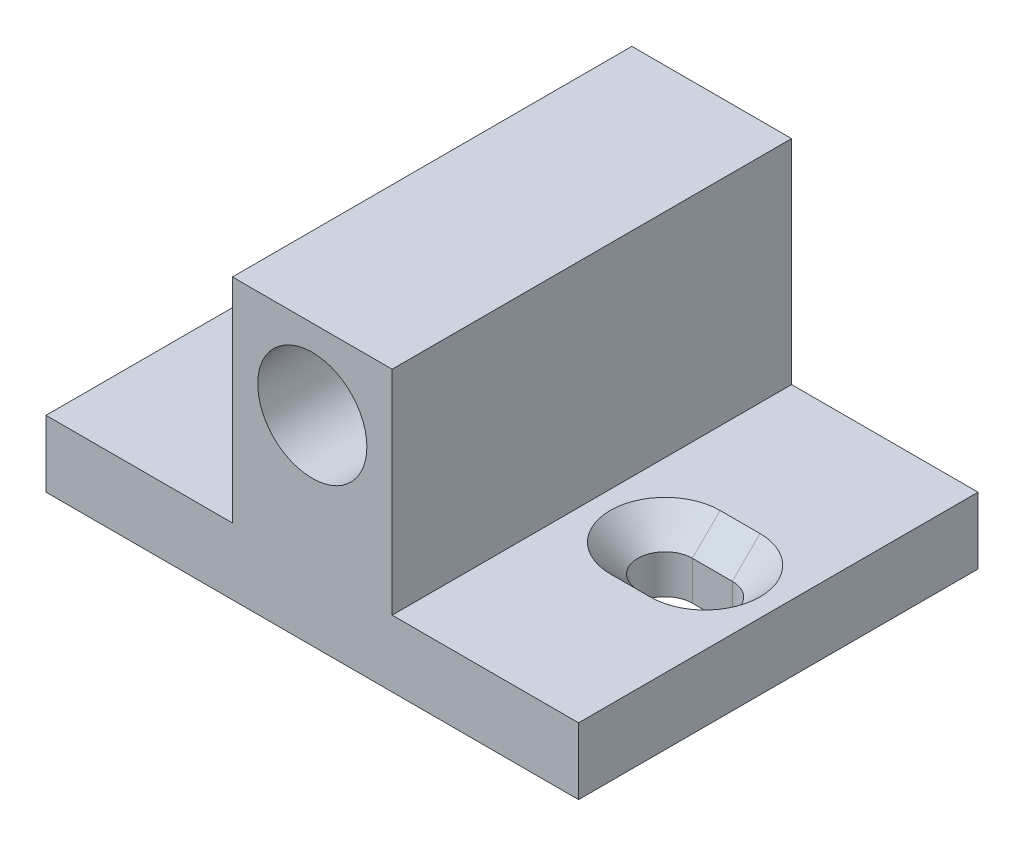
ISO-10303-21;
HEADER;
FILE_DESCRIPTION(('STEP AP214'),'2;1');
FILE_NAME('part.step','',(''),(''),'','','');
FILE_SCHEMA(('AUTOMOTIVE_DESIGN { 1 0 10303 214 1 1 1 1 }'));
ENDSEC;
DATA;
#1=APPLICATION_CONTEXT('core data for automotive mechanical design processes');
#2=APPLICATION_PROTOCOL_DEFINITION('international standard','automotive_design',2000,#1);
#3=PRODUCT_CONTEXT('',#1,'mechanical');
#4=PRODUCT('Part','Part','',(#3));
#5=PRODUCT_RELATED_PRODUCT_CATEGORY('part','',(#4));
#6=PRODUCT_DEFINITION_FORMATION('','',#4);
#7=PRODUCT_DEFINITION_CONTEXT('part definition',#1,'design');
#8=PRODUCT_DEFINITION('design','',#6,#7);
#9=PRODUCT_DEFINITION_SHAPE('','',#8);
#10=(LENGTH_UNIT() NAMED_UNIT(*) SI_UNIT(.MILLI.,.METRE.));
#11=(NAMED_UNIT(*) PLANE_ANGLE_UNIT() SI_UNIT($,.RADIAN.));
#12=(NAMED_UNIT(*) SI_UNIT($,.STERADIAN.) SOLID_ANGLE_UNIT());
#13=UNCERTAINTY_MEASURE_WITH_UNIT(LENGTH_MEASURE(1.E-05),#10,'distance_accuracy_value','');
#14=(GEOMETRIC_REPRESENTATION_CONTEXT(3) GLOBAL_UNCERTAINTY_ASSIGNED_CONTEXT((#13)) GLOBAL_UNIT_ASSIGNED_CONTEXT((#10,
#11,#12)) REPRESENTATION_CONTEXT('',''));
#15=CARTESIAN_POINT('',(0.,0.,0.));
#16=DIRECTION('',(0.,0.,1.));
#17=DIRECTION('',(1.,0.,0.));
#18=AXIS2_PLACEMENT_3D('',#15,#16,#17);
#19=CARTESIAN_POINT('',(0.,5.,0.));
#20=DIRECTION('',(0.,1.,0.));
#21=DIRECTION('',(0.,0.,1.));
#22=AXIS2_PLACEMENT_3D('',#19,#20,#21);
#23=PLANE('',#22);
#24=DIRECTION('',(0.,0.,-1.));
#25=VECTOR('',#24,1.);
#26=CARTESIAN_POINT('',(6.,5.,-15.));
#27=LINE('',#26,#25);
#28=CARTESIAN_POINT('',(6.,5.,15.));
#29=VERTEX_POINT('',#28);
#30=CARTESIAN_POINT('',(6.,5.,-15.));
#31=VERTEX_POINT('',#30);
#32=EDGE_CURVE('E428',#29,#31,#27,.T.);
#33=ORIENTED_EDGE('',*,*,#32,.F.);
#34=DIRECTION('',(1.,0.,0.));
#35=VECTOR('',#34,1.);
#36=CARTESIAN_POINT('',(-20.,5.,15.));
#37=LINE('',#36,#35);
#38=CARTESIAN_POINT('',(20.,5.,15.));
#39=VERTEX_POINT('',#38);
#40=EDGE_CURVE('E467',#29,#39,#37,.T.);
#41=ORIENTED_EDGE('',*,*,#40,.T.);
#42=DIRECTION('',(0.,0.,-1.));
#43=VECTOR('',#42,1.);
#44=CARTESIAN_POINT('',(20.,5.,-15.));
#45=LINE('',#44,#43);
#46=CARTESIAN_POINT('',(20.,5.,-15.));
#47=VERTEX_POINT('',#46);
#48=EDGE_CURVE('E458',#39,#47,#45,.T.);
#49=ORIENTED_EDGE('',*,*,#48,.T.);
#50=DIRECTION('',(-1.,0.,0.));
#51=VECTOR('',#50,1.);
#52=CARTESIAN_POINT('',(-20.,5.,-15.));
#53=LINE('',#52,#51);
#54=EDGE_CURVE('E463',#47,#31,#53,.T.);
#55=ORIENTED_EDGE('',*,*,#54,.T.);
#56=EDGE_LOOP('',(#33,#41,#49,#55));
#57=FACE_BOUND('',#56,.T.);
#58=CARTESIAN_POINT('',(14.5,5.,0.));
#59=DIRECTION('',(0.,1.,0.));
#60=DIRECTION('',(0.,0.,1.));
#61=AXIS2_PLACEMENT_3D('',#58,#59,#60);
#62=CIRCLE('',#61,4.125);
#63=CARTESIAN_POINT('',(14.5,5.,4.125));
#64=VERTEX_POINT('',#63);
#65=CARTESIAN_POINT('',(14.5,5.,-4.12500000000001));
#66=VERTEX_POINT('',#65);
#67=EDGE_CURVE('E201',#64,#66,#62,.T.);
#68=ORIENTED_EDGE('',*,*,#67,.F.);
#69=DIRECTION('',(-1.,0.,0.));
#70=VECTOR('',#69,1.);
#71=CARTESIAN_POINT('',(14.5,5.,4.125));
#72=LINE('',#71,#70);
#73=CARTESIAN_POINT('',(11.5,5.,4.125));
#74=VERTEX_POINT('',#73);
#75=EDGE_CURVE('E326',#64,#74,#72,.T.);
#76=ORIENTED_EDGE('',*,*,#75,.T.);
#77=CARTESIAN_POINT('',(11.5,5.,0.));
#78=DIRECTION('',(0.,1.,0.));
#79=DIRECTION('',(0.,0.,1.));
#80=AXIS2_PLACEMENT_3D('',#77,#78,#79);
#81=CIRCLE('',#80,4.125);
#82=CARTESIAN_POINT('',(11.5,5.,-4.12500000000003));
#83=VERTEX_POINT('',#82);
#84=EDGE_CURVE('E357',#83,#74,#81,.T.);
#85=ORIENTED_EDGE('',*,*,#84,.F.);
#86=DIRECTION('',(-1.,0.,0.));
#87=VECTOR('',#86,1.);
#88=CARTESIAN_POINT('',(14.5,5.,-4.12500000000003));
#89=LINE('',#88,#87);
#90=EDGE_CURVE('E344',#66,#83,#89,.T.);
#91=ORIENTED_EDGE('',*,*,#90,.F.);
#92=EDGE_LOOP('',(#68,#76,#85,#91));
#93=FACE_BOUND('',#92,.T.);
#94=ADVANCED_FACE('F186',(#57,#93),#23,.T.);
#95=DIRECTION('',(0.,0.,1.));
#96=VECTOR('',#95,1.);
#97=CARTESIAN_POINT('',(-6.,5.,-15.));
#98=LINE('',#97,#96);
#99=CARTESIAN_POINT('',(-6.,5.,-15.));
#100=VERTEX_POINT('',#99);
#101=CARTESIAN_POINT('',(-6.,5.,15.));
#102=VERTEX_POINT('',#101);
#103=EDGE_CURVE('E435',#100,#102,#98,.T.);
#104=ORIENTED_EDGE('',*,*,#103,.F.);
#105=CARTESIAN_POINT('',(-20.,5.,-15.));
#106=VERTEX_POINT('',#105);
#107=EDGE_CURVE('E461',#100,#106,#53,.T.);
#108=ORIENTED_EDGE('',*,*,#107,.T.);
#109=DIRECTION('',(0.,0.,1.));
#110=VECTOR('',#109,1.);
#111=CARTESIAN_POINT('',(-20.,5.,-15.));
#112=LINE('',#111,#110);
#113=CARTESIAN_POINT('',(-20.,5.,15.));
#114=VERTEX_POINT('',#113);
#115=EDGE_CURVE('E465',#106,#114,#112,.T.);
#116=ORIENTED_EDGE('',*,*,#115,.T.);
#117=EDGE_CURVE('E468',#114,#102,#37,.T.);
#118=ORIENTED_EDGE('',*,*,#117,.T.);
#119=EDGE_LOOP('',(#104,#108,#116,#118));
#120=FACE_BOUND('',#119,.T.);
#121=CARTESIAN_POINT('',(-14.5,5.,0.));
#122=DIRECTION('',(0.,1.,0.));
#123=DIRECTION('',(0.,0.,1.));
#124=AXIS2_PLACEMENT_3D('',#121,#122,#123);
#125=CIRCLE('',#124,4.125);
#126=CARTESIAN_POINT('',(-14.5,5.,-4.125));
#127=VERTEX_POINT('',#126);
#128=CARTESIAN_POINT('',(-14.5,5.,4.125));
#129=VERTEX_POINT('',#128);
#130=EDGE_CURVE('E390',#127,#129,#125,.T.);
#131=ORIENTED_EDGE('',*,*,#130,.F.);
#132=DIRECTION('',(1.,0.,0.));
#133=VECTOR('',#132,1.);
#134=CARTESIAN_POINT('',(-14.5,5.,-4.125));
#135=LINE('',#134,#133);
#136=CARTESIAN_POINT('',(-11.5,5.,-4.125));
#137=VERTEX_POINT('',#136);
#138=EDGE_CURVE('E382',#127,#137,#135,.T.);
#139=ORIENTED_EDGE('',*,*,#138,.T.);
#140=CARTESIAN_POINT('',(-11.5,5.,0.));
#141=DIRECTION('',(0.,1.,0.));
#142=DIRECTION('',(0.,0.,1.));
#143=AXIS2_PLACEMENT_3D('',#140,#141,#142);
#144=CIRCLE('',#143,4.125);
#145=CARTESIAN_POINT('',(-11.5,5.,4.12500000000003));
#146=VERTEX_POINT('',#145);
#147=EDGE_CURVE('E410',#146,#137,#144,.T.);
#148=ORIENTED_EDGE('',*,*,#147,.F.);
#149=DIRECTION('',(1.,0.,0.));
#150=VECTOR('',#149,1.);
#151=CARTESIAN_POINT('',(-14.5,5.,4.12500000000003));
#152=LINE('',#151,#150);
#153=EDGE_CURVE('E369',#129,#146,#152,.T.);
#154=ORIENTED_EDGE('',*,*,#153,.F.);
#155=EDGE_LOOP('',(#131,#139,#148,#154));
#156=FACE_BOUND('',#155,.T.);
#157=ADVANCED_FACE('F518',(#120,#156),#23,.T.);
#158=CARTESIAN_POINT('',(20.,5.,-15.));
#159=DIRECTION('',(-1.,0.,0.));
#160=DIRECTION('',(0.,0.,1.));
#161=AXIS2_PLACEMENT_3D('',#158,#159,#160);
#162=PLANE('',#161);
#163=DIRECTION('',(0.,0.,-1.));
#164=VECTOR('',#163,1.);
#165=CARTESIAN_POINT('',(20.,0.,-15.));
#166=LINE('',#165,#164);
#167=CARTESIAN_POINT('',(20.,0.,15.));
#168=VERTEX_POINT('',#167);
#169=CARTESIAN_POINT('',(20.,0.,-15.));
#170=VERTEX_POINT('',#169);
#171=EDGE_CURVE('E457',#168,#170,#166,.T.);
#172=ORIENTED_EDGE('',*,*,#171,.T.);
#173=DIRECTION('',(0.,-1.,0.));
#174=VECTOR('',#173,1.);
#175=CARTESIAN_POINT('',(20.,5.,-15.));
#176=LINE('',#175,#174);
#177=EDGE_CURVE('E13',#47,#170,#176,.T.);
#178=ORIENTED_EDGE('',*,*,#177,.F.);
#179=ORIENTED_EDGE('',*,*,#48,.F.);
#180=DIRECTION('',(0.,-1.,0.));
#181=VECTOR('',#180,1.);
#182=CARTESIAN_POINT('',(20.,5.,15.));
#183=LINE('',#182,#181);
#184=EDGE_CURVE('E470',#39,#168,#183,.T.);
#185=ORIENTED_EDGE('',*,*,#184,.T.);
#186=EDGE_LOOP('',(#172,#178,#179,#185));
#187=FACE_BOUND('',#186,.T.);
#188=ADVANCED_FACE('F188',(#187),#162,.F.);
#189=CARTESIAN_POINT('',(-20.,5.,-15.));
#190=DIRECTION('',(0.,0.,1.));
#191=DIRECTION('',(1.,0.,0.));
#192=AXIS2_PLACEMENT_3D('',#189,#190,#191);
#193=PLANE('',#192);
#194=DIRECTION('',(-1.,0.,0.));
#195=VECTOR('',#194,1.);
#196=CARTESIAN_POINT('',(-20.,0.,-15.));
#197=LINE('',#196,#195);
#198=CARTESIAN_POINT('',(-20.,0.,-15.));
#199=VERTEX_POINT('',#198);
#200=EDGE_CURVE('E473',#170,#199,#197,.T.);
#201=ORIENTED_EDGE('',*,*,#200,.T.);
#202=DIRECTION('',(0.,-1.,0.));
#203=VECTOR('',#202,1.);
#204=CARTESIAN_POINT('',(-20.,5.,-15.));
#205=LINE('',#204,#203);
#206=EDGE_CURVE('E194',#106,#199,#205,.T.);
#207=ORIENTED_EDGE('',*,*,#206,.F.);
#208=ORIENTED_EDGE('',*,*,#107,.F.);
#209=DIRECTION('',(0.,-1.,0.));
#210=VECTOR('',#209,1.);
#211=CARTESIAN_POINT('',(-6.,21.,-15.));
#212=LINE('',#211,#210);
#213=CARTESIAN_POINT('',(-6.,21.,-15.));
#214=VERTEX_POINT('',#213);
#215=EDGE_CURVE('E451',#214,#100,#212,.T.);
#216=ORIENTED_EDGE('',*,*,#215,.F.);
#217=DIRECTION('',(-1.,0.,0.));
#218=VECTOR('',#217,1.);
#219=CARTESIAN_POINT('',(-6.,21.,-15.));
#220=LINE('',#219,#218);
#221=CARTESIAN_POINT('',(6.,21.,-15.));
#222=VERTEX_POINT('',#221);
#223=EDGE_CURVE('E434',#222,#214,#220,.T.);
#224=ORIENTED_EDGE('',*,*,#223,.F.);
#225=DIRECTION('',(0.,-1.,0.));
#226=VECTOR('',#225,1.);
#227=CARTESIAN_POINT('',(6.,21.,-15.));
#228=LINE('',#227,#226);
#229=EDGE_CURVE('E454',#222,#31,#228,.T.);
#230=ORIENTED_EDGE('',*,*,#229,.T.);
#231=ORIENTED_EDGE('',*,*,#54,.F.);
#232=ORIENTED_EDGE('',*,*,#177,.T.);
#233=EDGE_LOOP('',(#201,#207,#208,#216,#224,#230,#231,#232));
#234=FACE_BOUND('',#233,.T.);
#235=ADVANCED_FACE('F520',(#234),#193,.F.);
#236=CARTESIAN_POINT('',(-20.,5.,-15.));
#237=DIRECTION('',(1.,0.,0.));
#238=DIRECTION('',(0.,0.,-1.));
#239=AXIS2_PLACEMENT_3D('',#236,#237,#238);
#240=PLANE('',#239);
#241=DIRECTION('',(0.,0.,1.));
#242=VECTOR('',#241,1.);
#243=CARTESIAN_POINT('',(-20.,0.,-15.));
#244=LINE('',#243,#242);
#245=CARTESIAN_POINT('',(-20.,0.,15.));
#246=VERTEX_POINT('',#245);
#247=EDGE_CURVE('E475',#199,#246,#244,.T.);
#248=ORIENTED_EDGE('',*,*,#247,.T.);
#249=DIRECTION('',(0.,-1.,0.));
#250=VECTOR('',#249,1.);
#251=CARTESIAN_POINT('',(-20.,5.,15.));
#252=LINE('',#251,#250);
#253=EDGE_CURVE('E480',#114,#246,#252,.T.);
#254=ORIENTED_EDGE('',*,*,#253,.F.);
#255=ORIENTED_EDGE('',*,*,#115,.F.);
#256=ORIENTED_EDGE('',*,*,#206,.T.);
#257=EDGE_LOOP('',(#248,#254,#255,#256));
#258=FACE_BOUND('',#257,.T.);
#259=ADVANCED_FACE('F487',(#258),#240,.F.);
#260=CARTESIAN_POINT('',(-20.,5.,15.));
#261=DIRECTION('',(0.,0.,-1.));
#262=DIRECTION('',(-1.,0.,0.));
#263=AXIS2_PLACEMENT_3D('',#260,#261,#262);
#264=PLANE('',#263);
#265=CARTESIAN_POINT('',(0.,15.,15.));
#266=DIRECTION('',(0.,0.,1.));
#267=DIRECTION('',(1.,0.,0.));
#268=AXIS2_PLACEMENT_3D('',#265,#266,#267);
#269=CIRCLE('',#268,4.1);
#270=CARTESIAN_POINT('',(4.1,15.,15.));
#271=VERTEX_POINT('',#270);
#272=EDGE_CURVE('E424',#271,#271,#269,.T.);
#273=ORIENTED_EDGE('',*,*,#272,.F.);
#274=EDGE_LOOP('',(#273));
#275=FACE_BOUND('',#274,.T.);
#276=DIRECTION('',(1.,0.,0.));
#277=VECTOR('',#276,1.);
#278=CARTESIAN_POINT('',(-20.,0.,15.));
#279=LINE('',#278,#277);
#280=EDGE_CURVE('E462',#246,#168,#279,.T.);
#281=ORIENTED_EDGE('',*,*,#280,.T.);
#282=ORIENTED_EDGE('',*,*,#184,.F.);
#283=ORIENTED_EDGE('',*,*,#40,.F.);
#284=DIRECTION('',(0.,-1.,0.));
#285=VECTOR('',#284,1.);
#286=CARTESIAN_POINT('',(6.,21.,15.));
#287=LINE('',#286,#285);
#288=CARTESIAN_POINT('',(6.,21.,15.));
#289=VERTEX_POINT('',#288);
#290=EDGE_CURVE('E441',#289,#29,#287,.T.);
#291=ORIENTED_EDGE('',*,*,#290,.F.);
#292=DIRECTION('',(1.,0.,0.));
#293=VECTOR('',#292,1.);
#294=CARTESIAN_POINT('',(-6.,21.,15.));
#295=LINE('',#294,#293);
#296=CARTESIAN_POINT('',(-6.,21.,15.));
#297=VERTEX_POINT('',#296);
#298=EDGE_CURVE('E439',#297,#289,#295,.T.);
#299=ORIENTED_EDGE('',*,*,#298,.F.);
#300=DIRECTION('',(0.,-1.,0.));
#301=VECTOR('',#300,1.);
#302=CARTESIAN_POINT('',(-6.,21.,15.));
#303=LINE('',#302,#301);
#304=EDGE_CURVE('E448',#297,#102,#303,.T.);
#305=ORIENTED_EDGE('',*,*,#304,.T.);
#306=ORIENTED_EDGE('',*,*,#117,.F.);
#307=ORIENTED_EDGE('',*,*,#253,.T.);
#308=EDGE_LOOP('',(#281,#282,#283,#291,#299,#305,#306,#307));
#309=FACE_BOUND('',#308,.T.);
#310=ADVANCED_FACE('F497',(#275,#309),#264,.F.);
#311=CARTESIAN_POINT('',(0.,0.,0.));
#312=DIRECTION('',(0.,1.,0.));
#313=DIRECTION('',(0.,0.,1.));
#314=AXIS2_PLACEMENT_3D('',#311,#312,#313);
#315=PLANE('',#314);
#316=DIRECTION('',(-1.,0.,0.));
#317=VECTOR('',#316,1.);
#318=CARTESIAN_POINT('',(14.5,0.,-2.04999999999999));
#319=LINE('',#318,#317);
#320=CARTESIAN_POINT('',(14.5,0.,-2.04999999999999));
#321=VERTEX_POINT('',#320);
#322=CARTESIAN_POINT('',(11.5,0.,-2.04999999999999));
#323=VERTEX_POINT('',#322);
#324=EDGE_CURVE('E863',#321,#323,#319,.T.);
#325=ORIENTED_EDGE('',*,*,#324,.T.);
#326=CARTESIAN_POINT('',(11.5,0.,0.));
#327=DIRECTION('',(0.,1.,0.));
#328=DIRECTION('',(0.,0.,1.));
#329=AXIS2_PLACEMENT_3D('',#326,#327,#328);
#330=CIRCLE('',#329,2.04999999999999);
#331=CARTESIAN_POINT('',(11.5,0.,2.04999999999999));
#332=VERTEX_POINT('',#331);
#333=EDGE_CURVE('E362',#323,#332,#330,.T.);
#334=ORIENTED_EDGE('',*,*,#333,.T.);
#335=DIRECTION('',(-1.,0.,0.));
#336=VECTOR('',#335,1.);
#337=CARTESIAN_POINT('',(14.5,0.,2.04999999999999));
#338=LINE('',#337,#336);
#339=CARTESIAN_POINT('',(14.5,0.,2.04999999999999));
#340=VERTEX_POINT('',#339);
#341=EDGE_CURVE('E865',#340,#332,#338,.T.);
#342=ORIENTED_EDGE('',*,*,#341,.F.);
#343=CARTESIAN_POINT('',(14.5,0.,0.));
#344=DIRECTION('',(0.,1.,0.));
#345=DIRECTION('',(0.,0.,1.));
#346=AXIS2_PLACEMENT_3D('',#343,#344,#345);
#347=CIRCLE('',#346,2.04999999999999);
#348=EDGE_CURVE('E209',#340,#321,#347,.T.);
#349=ORIENTED_EDGE('',*,*,#348,.T.);
#350=EDGE_LOOP('',(#325,#334,#342,#349));
#351=FACE_BOUND('',#350,.T.);
#352=DIRECTION('',(1.,0.,0.));
#353=VECTOR('',#352,1.);
#354=CARTESIAN_POINT('',(-14.5,0.,-2.04999999999999));
#355=LINE('',#354,#353);
#356=CARTESIAN_POINT('',(-14.5,0.,-2.04999999999999));
#357=VERTEX_POINT('',#356);
#358=CARTESIAN_POINT('',(-11.5,0.,-2.04999999999999));
#359=VERTEX_POINT('',#358);
#360=EDGE_CURVE('E377',#357,#359,#355,.T.);
#361=ORIENTED_EDGE('',*,*,#360,.F.);
#362=CARTESIAN_POINT('',(-14.5,0.,0.));
#363=DIRECTION('',(0.,1.,0.));
#364=DIRECTION('',(0.,0.,1.));
#365=AXIS2_PLACEMENT_3D('',#362,#363,#364);
#366=CIRCLE('',#365,2.04999999999999);
#367=CARTESIAN_POINT('',(-14.5,0.,2.04999999999999));
#368=VERTEX_POINT('',#367);
#369=EDGE_CURVE('E395',#357,#368,#366,.T.);
#370=ORIENTED_EDGE('',*,*,#369,.T.);
#371=DIRECTION('',(1.,0.,0.));
#372=VECTOR('',#371,1.);
#373=CARTESIAN_POINT('',(-14.5,0.,2.04999999999999));
#374=LINE('',#373,#372);
#375=CARTESIAN_POINT('',(-11.5,0.,2.04999999999999));
#376=VERTEX_POINT('',#375);
#377=EDGE_CURVE('E374',#368,#376,#374,.T.);
#378=ORIENTED_EDGE('',*,*,#377,.T.);
#379=CARTESIAN_POINT('',(-11.5,0.,0.));
#380=DIRECTION('',(0.,1.,0.));
#381=DIRECTION('',(0.,0.,1.));
#382=AXIS2_PLACEMENT_3D('',#379,#380,#381);
#383=CIRCLE('',#382,2.04999999999999);
#384=EDGE_CURVE('E416',#376,#359,#383,.T.);
#385=ORIENTED_EDGE('',*,*,#384,.T.);
#386=EDGE_LOOP('',(#361,#370,#378,#385));
#387=FACE_BOUND('',#386,.T.);
#388=ORIENTED_EDGE('',*,*,#171,.F.);
#389=ORIENTED_EDGE('',*,*,#280,.F.);
#390=ORIENTED_EDGE('',*,*,#247,.F.);
#391=ORIENTED_EDGE('',*,*,#200,.F.);
#392=EDGE_LOOP('',(#388,#389,#390,#391));
#393=FACE_BOUND('',#392,.T.);
#394=ADVANCED_FACE('F494',(#351,#387,#393),#315,.F.);
#395=CARTESIAN_POINT('',(6.,21.,-15.));
#396=DIRECTION('',(-1.,0.,0.));
#397=DIRECTION('',(0.,0.,1.));
#398=AXIS2_PLACEMENT_3D('',#395,#396,#397);
#399=PLANE('',#398);
#400=ORIENTED_EDGE('',*,*,#32,.T.);
#401=ORIENTED_EDGE('',*,*,#229,.F.);
#402=DIRECTION('',(0.,0.,-1.));
#403=VECTOR('',#402,1.);
#404=CARTESIAN_POINT('',(6.,21.,-15.));
#405=LINE('',#404,#403);
#406=EDGE_CURVE('E431',#289,#222,#405,.T.);
#407=ORIENTED_EDGE('',*,*,#406,.F.);
#408=ORIENTED_EDGE('',*,*,#290,.T.);
#409=EDGE_LOOP('',(#400,#401,#407,#408));
#410=FACE_BOUND('',#409,.T.);
#411=ADVANCED_FACE('F508',(#410),#399,.F.);
#412=CARTESIAN_POINT('',(-6.,21.,-15.));
#413=DIRECTION('',(1.,0.,0.));
#414=DIRECTION('',(0.,0.,-1.));
#415=AXIS2_PLACEMENT_3D('',#412,#413,#414);
#416=PLANE('',#415);
#417=ORIENTED_EDGE('',*,*,#103,.T.);
#418=ORIENTED_EDGE('',*,*,#304,.F.);
#419=DIRECTION('',(0.,0.,1.));
#420=VECTOR('',#419,1.);
#421=CARTESIAN_POINT('',(-6.,21.,-15.));
#422=LINE('',#421,#420);
#423=EDGE_CURVE('E437',#214,#297,#422,.T.);
#424=ORIENTED_EDGE('',*,*,#423,.F.);
#425=ORIENTED_EDGE('',*,*,#215,.T.);
#426=EDGE_LOOP('',(#417,#418,#424,#425));
#427=FACE_BOUND('',#426,.T.);
#428=ADVANCED_FACE('F516',(#427),#416,.F.);
#429=CARTESIAN_POINT('',(0.,21.,0.));
#430=DIRECTION('',(0.,1.,0.));
#431=DIRECTION('',(0.,0.,1.));
#432=AXIS2_PLACEMENT_3D('',#429,#430,#431);
#433=PLANE('',#432);
#434=ORIENTED_EDGE('',*,*,#406,.T.);
#435=ORIENTED_EDGE('',*,*,#223,.T.);
#436=ORIENTED_EDGE('',*,*,#423,.T.);
#437=ORIENTED_EDGE('',*,*,#298,.T.);
#438=EDGE_LOOP('',(#434,#435,#436,#437));
#439=FACE_BOUND('',#438,.T.);
#440=ADVANCED_FACE('F511',(#439),#433,.T.);
#441=CARTESIAN_POINT('',(0.,15.,-10.));
#442=DIRECTION('',(0.,0.,1.));
#443=DIRECTION('',(1.,0.,0.));
#444=AXIS2_PLACEMENT_3D('',#441,#442,#443);
#445=CYLINDRICAL_SURFACE('',#444,4.1);
#446=CARTESIAN_POINT('',(0.,15.,-10.));
#447=DIRECTION('',(0.,0.,1.));
#448=DIRECTION('',(1.,0.,0.));
#449=AXIS2_PLACEMENT_3D('',#446,#447,#448);
#450=CIRCLE('',#449,4.1);
#451=CARTESIAN_POINT('',(4.1,15.,-10.));
#452=VERTEX_POINT('',#451);
#453=EDGE_CURVE('E425',#452,#452,#450,.T.);
#454=ORIENTED_EDGE('',*,*,#453,.F.);
#455=EDGE_LOOP('',(#454));
#456=FACE_BOUND('',#455,.T.);
#457=ORIENTED_EDGE('',*,*,#272,.T.);
#458=EDGE_LOOP('',(#457));
#459=FACE_BOUND('',#458,.T.);
#460=ADVANCED_FACE('F544',(#456,#459),#445,.F.);
#461=CARTESIAN_POINT('',(0.,15.,-10.));
#462=DIRECTION('',(0.,0.,1.));
#463=DIRECTION('',(1.,0.,0.));
#464=AXIS2_PLACEMENT_3D('',#461,#462,#463);
#465=PLANE('',#464);
#466=ORIENTED_EDGE('',*,*,#453,.T.);
#467=EDGE_LOOP('',(#466));
#468=FACE_BOUND('',#467,.T.);
#469=ADVANCED_FACE('F546',(#468),#465,.T.);
#470=CARTESIAN_POINT('',(-11.5,5.,0.));
#471=DIRECTION('',(0.,1.,0.));
#472=DIRECTION('',(0.,0.,1.));
#473=AXIS2_PLACEMENT_3D('',#470,#471,#472);
#474=CYLINDRICAL_SURFACE('',#473,2.04999999999999);
#475=ORIENTED_EDGE('',*,*,#384,.F.);
#476=DIRECTION('',(0.,1.,0.));
#477=VECTOR('',#476,1.);
#478=CARTESIAN_POINT('',(-11.5,5.,2.04999999999999));
#479=LINE('',#478,#477);
#480=CARTESIAN_POINT('',(-11.5,2.925,2.04999999999999));
#481=VERTEX_POINT('',#480);
#482=EDGE_CURVE('E407',#481,#376,#479,.F.);
#483=ORIENTED_EDGE('',*,*,#482,.F.);
#484=CARTESIAN_POINT('',(-11.5,2.925,0.));
#485=DIRECTION('',(0.,1.,0.));
#486=DIRECTION('',(0.,0.,1.));
#487=AXIS2_PLACEMENT_3D('',#484,#485,#486);
#488=CIRCLE('',#487,2.05);
#489=CARTESIAN_POINT('',(-11.5,2.925,-2.05));
#490=VERTEX_POINT('',#489);
#491=EDGE_CURVE('E413',#481,#490,#488,.T.);
#492=ORIENTED_EDGE('',*,*,#491,.T.);
#493=DIRECTION('',(0.,1.,0.));
#494=VECTOR('',#493,1.);
#495=CARTESIAN_POINT('',(-11.5,5.,-2.04999999999999));
#496=LINE('',#495,#494);
#497=EDGE_CURVE('E404',#359,#490,#496,.T.);
#498=ORIENTED_EDGE('',*,*,#497,.F.);
#499=EDGE_LOOP('',(#475,#483,#492,#498));
#500=FACE_BOUND('',#499,.T.);
#501=ADVANCED_FACE('F553',(#500),#474,.F.);
#502=CARTESIAN_POINT('',(-11.5,5.,0.));
#503=DIRECTION('',(0.,1.,0.));
#504=DIRECTION('',(0.,0.,1.));
#505=AXIS2_PLACEMENT_3D('',#502,#503,#504);
#506=CONICAL_SURFACE('',#505,4.125,0.785398163397448);
#507=ORIENTED_EDGE('',*,*,#491,.F.);
#508=DIRECTION('',(0.,0.707106781186548,0.707106781186547));
#509=VECTOR('',#508,1.);
#510=CARTESIAN_POINT('',(-11.5,0.874999999999998,0.));
#511=LINE('',#510,#509);
#512=EDGE_CURVE('E421',#146,#481,#511,.F.);
#513=ORIENTED_EDGE('',*,*,#512,.F.);
#514=ORIENTED_EDGE('',*,*,#147,.T.);
#515=DIRECTION('',(0.,-0.707106781186548,0.707106781186547));
#516=VECTOR('',#515,1.);
#517=CARTESIAN_POINT('',(-11.5,0.874999999999998,0.));
#518=LINE('',#517,#516);
#519=EDGE_CURVE('E419',#490,#137,#518,.F.);
#520=ORIENTED_EDGE('',*,*,#519,.F.);
#521=EDGE_LOOP('',(#507,#513,#514,#520));
#522=FACE_BOUND('',#521,.T.);
#523=ADVANCED_FACE('F729',(#522),#506,.F.);
#524=CARTESIAN_POINT('',(-14.5,5.,0.));
#525=DIRECTION('',(0.,1.,0.));
#526=DIRECTION('',(0.,0.,1.));
#527=AXIS2_PLACEMENT_3D('',#524,#525,#526);
#528=CYLINDRICAL_SURFACE('',#527,2.04999999999999);
#529=CARTESIAN_POINT('',(-14.5,2.925,0.));
#530=DIRECTION('',(0.,1.,0.));
#531=DIRECTION('',(0.,0.,1.));
#532=AXIS2_PLACEMENT_3D('',#529,#530,#531);
#533=CIRCLE('',#532,2.05);
#534=CARTESIAN_POINT('',(-14.5,2.925,-2.05));
#535=VERTEX_POINT('',#534);
#536=CARTESIAN_POINT('',(-14.5,2.925,2.04999999999999));
#537=VERTEX_POINT('',#536);
#538=EDGE_CURVE('E392',#535,#537,#533,.T.);
#539=ORIENTED_EDGE('',*,*,#538,.T.);
#540=DIRECTION('',(0.,1.,0.));
#541=VECTOR('',#540,1.);
#542=CARTESIAN_POINT('',(-14.5,5.,2.04999999999999));
#543=LINE('',#542,#541);
#544=EDGE_CURVE('E385',#368,#537,#543,.T.);
#545=ORIENTED_EDGE('',*,*,#544,.F.);
#546=ORIENTED_EDGE('',*,*,#369,.F.);
#547=DIRECTION('',(0.,1.,0.));
#548=VECTOR('',#547,1.);
#549=CARTESIAN_POINT('',(-14.5,5.,-2.04999999999999));
#550=LINE('',#549,#548);
#551=EDGE_CURVE('E388',#535,#357,#550,.F.);
#552=ORIENTED_EDGE('',*,*,#551,.F.);
#553=EDGE_LOOP('',(#539,#545,#546,#552));
#554=FACE_BOUND('',#553,.T.);
#555=ADVANCED_FACE('F719',(#554),#528,.F.);
#556=CARTESIAN_POINT('',(-14.5,5.,0.));
#557=DIRECTION('',(0.,1.,0.));
#558=DIRECTION('',(0.,0.,1.));
#559=AXIS2_PLACEMENT_3D('',#556,#557,#558);
#560=CONICAL_SURFACE('',#559,4.125,0.785398163397448);
#561=ORIENTED_EDGE('',*,*,#130,.T.);
#562=DIRECTION('',(0.,-0.707106781186548,-0.707106781186547));
#563=VECTOR('',#562,1.);
#564=CARTESIAN_POINT('',(-14.5,0.874999999999998,0.));
#565=LINE('',#564,#563);
#566=EDGE_CURVE('E398',#537,#129,#565,.F.);
#567=ORIENTED_EDGE('',*,*,#566,.F.);
#568=ORIENTED_EDGE('',*,*,#538,.F.);
#569=DIRECTION('',(0.,0.707106781186548,-0.707106781186547));
#570=VECTOR('',#569,1.);
#571=CARTESIAN_POINT('',(-14.5,0.874999999999998,0.));
#572=LINE('',#571,#570);
#573=EDGE_CURVE('E401',#127,#535,#572,.F.);
#574=ORIENTED_EDGE('',*,*,#573,.F.);
#575=EDGE_LOOP('',(#561,#567,#568,#574));
#576=FACE_BOUND('',#575,.T.);
#577=ADVANCED_FACE('F709',(#576),#560,.F.);
#578=CARTESIAN_POINT('',(-14.5,0.874999999999998,0.));
#579=DIRECTION('',(0.,-0.707106781186547,-0.707106781186548));
#580=DIRECTION('',(0.,0.707106781186548,-0.707106781186547));
#581=AXIS2_PLACEMENT_3D('',#578,#579,#580);
#582=PLANE('',#581);
#583=ORIENTED_EDGE('',*,*,#519,.T.);
#584=ORIENTED_EDGE('',*,*,#138,.F.);
#585=ORIENTED_EDGE('',*,*,#573,.T.);
#586=DIRECTION('',(1.,0.,0.));
#587=VECTOR('',#586,1.);
#588=CARTESIAN_POINT('',(-14.5,2.925,-2.05));
#589=LINE('',#588,#587);
#590=EDGE_CURVE('E380',#535,#490,#589,.T.);
#591=ORIENTED_EDGE('',*,*,#590,.T.);
#592=EDGE_LOOP('',(#583,#584,#585,#591));
#593=FACE_BOUND('',#592,.T.);
#594=ADVANCED_FACE('F699',(#593),#582,.F.);
#595=CARTESIAN_POINT('',(-14.5,5.,-2.04999999999999));
#596=DIRECTION('',(0.,0.,-1.));
#597=DIRECTION('',(-1.,0.,0.));
#598=AXIS2_PLACEMENT_3D('',#595,#596,#597);
#599=PLANE('',#598);
#600=ORIENTED_EDGE('',*,*,#497,.T.);
#601=ORIENTED_EDGE('',*,*,#590,.F.);
#602=ORIENTED_EDGE('',*,*,#551,.T.);
#603=ORIENTED_EDGE('',*,*,#360,.T.);
#604=EDGE_LOOP('',(#600,#601,#602,#603));
#605=FACE_BOUND('',#604,.T.);
#606=ADVANCED_FACE('F689',(#605),#599,.F.);
#607=CARTESIAN_POINT('',(-14.5,5.,2.04999999999999));
#608=DIRECTION('',(0.,0.,1.));
#609=DIRECTION('',(1.,0.,0.));
#610=AXIS2_PLACEMENT_3D('',#607,#608,#609);
#611=PLANE('',#610);
#612=ORIENTED_EDGE('',*,*,#482,.T.);
#613=ORIENTED_EDGE('',*,*,#377,.F.);
#614=ORIENTED_EDGE('',*,*,#544,.T.);
#615=DIRECTION('',(1.,0.,0.));
#616=VECTOR('',#615,1.);
#617=CARTESIAN_POINT('',(-14.5,2.925,2.04999999999999));
#618=LINE('',#617,#616);
#619=EDGE_CURVE('E371',#537,#481,#618,.T.);
#620=ORIENTED_EDGE('',*,*,#619,.T.);
#621=EDGE_LOOP('',(#612,#613,#614,#620));
#622=FACE_BOUND('',#621,.T.);
#623=ADVANCED_FACE('F680',(#622),#611,.F.);
#624=CARTESIAN_POINT('',(-14.5,0.874999999999998,0.));
#625=DIRECTION('',(0.,-0.707106781186547,0.707106781186548));
#626=DIRECTION('',(0.,-0.707106781186548,-0.707106781186547));
#627=AXIS2_PLACEMENT_3D('',#624,#625,#626);
#628=PLANE('',#627);
#629=ORIENTED_EDGE('',*,*,#512,.T.);
#630=ORIENTED_EDGE('',*,*,#619,.F.);
#631=ORIENTED_EDGE('',*,*,#566,.T.);
#632=ORIENTED_EDGE('',*,*,#153,.T.);
#633=EDGE_LOOP('',(#629,#630,#631,#632));
#634=FACE_BOUND('',#633,.T.);
#635=ADVANCED_FACE('F586',(#634),#628,.F.);
#636=CARTESIAN_POINT('',(11.5,5.,0.));
#637=DIRECTION('',(0.,1.,0.));
#638=DIRECTION('',(0.,0.,1.));
#639=AXIS2_PLACEMENT_3D('',#636,#637,#638);
#640=CYLINDRICAL_SURFACE('',#639,2.04999999999999);
#641=CARTESIAN_POINT('',(11.5,2.925,0.));
#642=DIRECTION('',(0.,1.,0.));
#643=DIRECTION('',(0.,0.,1.));
#644=AXIS2_PLACEMENT_3D('',#641,#642,#643);
#645=CIRCLE('',#644,2.05);
#646=CARTESIAN_POINT('',(11.5,2.925,-2.05));
#647=VERTEX_POINT('',#646);
#648=CARTESIAN_POINT('',(11.5,2.925,2.05));
#649=VERTEX_POINT('',#648);
#650=EDGE_CURVE('E359',#647,#649,#645,.T.);
#651=ORIENTED_EDGE('',*,*,#650,.T.);
#652=DIRECTION('',(0.,1.,0.));
#653=VECTOR('',#652,1.);
#654=CARTESIAN_POINT('',(11.5,5.,2.04999999999999));
#655=LINE('',#654,#653);
#656=EDGE_CURVE('E340',#332,#649,#655,.T.);
#657=ORIENTED_EDGE('',*,*,#656,.F.);
#658=ORIENTED_EDGE('',*,*,#333,.F.);
#659=DIRECTION('',(0.,1.,0.));
#660=VECTOR('',#659,1.);
#661=CARTESIAN_POINT('',(11.5,5.,-2.05));
#662=LINE('',#661,#660);
#663=EDGE_CURVE('E355',#647,#323,#662,.F.);
#664=ORIENTED_EDGE('',*,*,#663,.F.);
#665=EDGE_LOOP('',(#651,#657,#658,#664));
#666=FACE_BOUND('',#665,.T.);
#667=ADVANCED_FACE('F580',(#666),#640,.F.);
#668=CARTESIAN_POINT('',(11.5,5.,0.));
#669=DIRECTION('',(0.,1.,0.));
#670=DIRECTION('',(0.,0.,1.));
#671=AXIS2_PLACEMENT_3D('',#668,#669,#670);
#672=CONICAL_SURFACE('',#671,4.125,0.785398163397448);
#673=ORIENTED_EDGE('',*,*,#84,.T.);
#674=DIRECTION('',(0.,-0.707106781186547,-0.707106781186548));
#675=VECTOR('',#674,1.);
#676=CARTESIAN_POINT('',(11.5,0.874999999999997,0.));
#677=LINE('',#676,#675);
#678=EDGE_CURVE('E331',#649,#74,#677,.F.);
#679=ORIENTED_EDGE('',*,*,#678,.F.);
#680=ORIENTED_EDGE('',*,*,#650,.F.);
#681=DIRECTION('',(0.,0.707106781186547,-0.707106781186548));
#682=VECTOR('',#681,1.);
#683=CARTESIAN_POINT('',(11.5,0.874999999999997,0.));
#684=LINE('',#683,#682);
#685=EDGE_CURVE('E366',#83,#647,#684,.F.);
#686=ORIENTED_EDGE('',*,*,#685,.F.);
#687=EDGE_LOOP('',(#673,#679,#680,#686));
#688=FACE_BOUND('',#687,.T.);
#689=ADVANCED_FACE('F585',(#688),#672,.F.);
#690=CARTESIAN_POINT('',(14.5,5.,0.));
#691=DIRECTION('',(0.,1.,0.));
#692=DIRECTION('',(0.,0.,1.));
#693=AXIS2_PLACEMENT_3D('',#690,#691,#692);
#694=CYLINDRICAL_SURFACE('',#693,2.04999999999999);
#695=CARTESIAN_POINT('',(14.5,2.925,0.));
#696=DIRECTION('',(0.,1.,0.));
#697=DIRECTION('',(0.,0.,1.));
#698=AXIS2_PLACEMENT_3D('',#695,#696,#697);
#699=CIRCLE('',#698,2.05);
#700=CARTESIAN_POINT('',(14.5,2.925,2.04999999999999));
#701=VERTEX_POINT('',#700);
#702=CARTESIAN_POINT('',(14.5,2.925,-2.05));
#703=VERTEX_POINT('',#702);
#704=EDGE_CURVE('E339',#701,#703,#699,.T.);
#705=ORIENTED_EDGE('',*,*,#704,.T.);
#706=DIRECTION('',(0.,1.,0.));
#707=VECTOR('',#706,1.);
#708=CARTESIAN_POINT('',(14.5,5.,-2.05));
#709=LINE('',#708,#707);
#710=EDGE_CURVE('E335',#321,#703,#709,.T.);
#711=ORIENTED_EDGE('',*,*,#710,.F.);
#712=ORIENTED_EDGE('',*,*,#348,.F.);
#713=DIRECTION('',(0.,1.,0.));
#714=VECTOR('',#713,1.);
#715=CARTESIAN_POINT('',(14.5,5.,2.04999999999999));
#716=LINE('',#715,#714);
#717=EDGE_CURVE('E345',#701,#340,#716,.F.);
#718=ORIENTED_EDGE('',*,*,#717,.F.);
#719=EDGE_LOOP('',(#705,#711,#712,#718));
#720=FACE_BOUND('',#719,.T.);
#721=ADVANCED_FACE('F598',(#720),#694,.F.);
#722=CARTESIAN_POINT('',(14.5,5.,0.));
#723=DIRECTION('',(0.,1.,0.));
#724=DIRECTION('',(0.,0.,1.));
#725=AXIS2_PLACEMENT_3D('',#722,#723,#724);
#726=CONICAL_SURFACE('',#725,4.125,0.785398163397448);
#727=ORIENTED_EDGE('',*,*,#67,.T.);
#728=DIRECTION('',(0.,-0.707106781186547,0.707106781186548));
#729=VECTOR('',#728,1.);
#730=CARTESIAN_POINT('',(14.5,0.874999999999997,0.));
#731=LINE('',#730,#729);
#732=EDGE_CURVE('E341',#703,#66,#731,.F.);
#733=ORIENTED_EDGE('',*,*,#732,.F.);
#734=ORIENTED_EDGE('',*,*,#704,.F.);
#735=DIRECTION('',(0.,0.707106781186547,0.707106781186548));
#736=VECTOR('',#735,1.);
#737=CARTESIAN_POINT('',(14.5,0.874999999999997,0.));
#738=LINE('',#737,#736);
#739=EDGE_CURVE('E328',#64,#701,#738,.F.);
#740=ORIENTED_EDGE('',*,*,#739,.F.);
#741=EDGE_LOOP('',(#727,#733,#734,#740));
#742=FACE_BOUND('',#741,.T.);
#743=ADVANCED_FACE('F338',(#742),#726,.F.);
#744=CARTESIAN_POINT('',(14.5,0.874999999999997,0.));
#745=DIRECTION('',(0.,-0.707106781186548,0.707106781186548));
#746=DIRECTION('',(0.,-0.707106781186548,-0.707106781186548));
#747=AXIS2_PLACEMENT_3D('',#744,#745,#746);
#748=PLANE('',#747);
#749=ORIENTED_EDGE('',*,*,#678,.T.);
#750=ORIENTED_EDGE('',*,*,#75,.F.);
#751=ORIENTED_EDGE('',*,*,#739,.T.);
#752=DIRECTION('',(-1.,0.,0.));
#753=VECTOR('',#752,1.);
#754=CARTESIAN_POINT('',(14.5,2.925,2.05));
#755=LINE('',#754,#753);
#756=EDGE_CURVE('E336',#701,#649,#755,.T.);
#757=ORIENTED_EDGE('',*,*,#756,.T.);
#758=EDGE_LOOP('',(#749,#750,#751,#757));
#759=FACE_BOUND('',#758,.T.);
#760=ADVANCED_FACE('F327',(#759),#748,.F.);
#761=CARTESIAN_POINT('',(14.5,5.,2.04999999999999));
#762=DIRECTION('',(0.,0.,1.));
#763=DIRECTION('',(1.,0.,0.));
#764=AXIS2_PLACEMENT_3D('',#761,#762,#763);
#765=PLANE('',#764);
#766=ORIENTED_EDGE('',*,*,#656,.T.);
#767=ORIENTED_EDGE('',*,*,#756,.F.);
#768=ORIENTED_EDGE('',*,*,#717,.T.);
#769=ORIENTED_EDGE('',*,*,#341,.T.);
#770=EDGE_LOOP('',(#766,#767,#768,#769));
#771=FACE_BOUND('',#770,.T.);
#772=ADVANCED_FACE('F627',(#771),#765,.F.);
#773=CARTESIAN_POINT('',(14.5,5.,-2.05));
#774=DIRECTION('',(0.,0.,-1.));
#775=DIRECTION('',(-1.,0.,0.));
#776=AXIS2_PLACEMENT_3D('',#773,#774,#775);
#777=PLANE('',#776);
#778=ORIENTED_EDGE('',*,*,#663,.T.);
#779=ORIENTED_EDGE('',*,*,#324,.F.);
#780=ORIENTED_EDGE('',*,*,#710,.T.);
#781=DIRECTION('',(-1.,0.,0.));
#782=VECTOR('',#781,1.);
#783=CARTESIAN_POINT('',(14.5,2.925,-2.05));
#784=LINE('',#783,#782);
#785=EDGE_CURVE('E858',#703,#647,#784,.T.);
#786=ORIENTED_EDGE('',*,*,#785,.T.);
#787=EDGE_LOOP('',(#778,#779,#780,#786));
#788=FACE_BOUND('',#787,.T.);
#789=ADVANCED_FACE('F637',(#788),#777,.F.);
#790=CARTESIAN_POINT('',(14.5,0.874999999999997,0.));
#791=DIRECTION('',(0.,-0.707106781186548,-0.707106781186548));
#792=DIRECTION('',(0.,0.707106781186548,-0.707106781186548));
#793=AXIS2_PLACEMENT_3D('',#790,#791,#792);
#794=PLANE('',#793);
#795=ORIENTED_EDGE('',*,*,#685,.T.);
#796=ORIENTED_EDGE('',*,*,#785,.F.);
#797=ORIENTED_EDGE('',*,*,#732,.T.);
#798=ORIENTED_EDGE('',*,*,#90,.T.);
#799=EDGE_LOOP('',(#795,#796,#797,#798));
#800=FACE_BOUND('',#799,.T.);
#801=ADVANCED_FACE('F648',(#800),#794,.F.);
#802=CLOSED_SHELL('',(#94,#157,#188,#235,#259,#310,#394,#411,#428,#440,#460,#469,#501,#523,#555,
#577,#594,#606,#623,#635,#667,#689,#721,#743,#760,#772,#789,#801));
#803=MANIFOLD_SOLID_BREP('B2',#802);
#804=ADVANCED_BREP_SHAPE_REPRESENTATION('',(#18,#803),#14);
#805=SHAPE_DEFINITION_REPRESENTATION(#9,#804);
ENDSEC;
END-ISO-10303-21;
